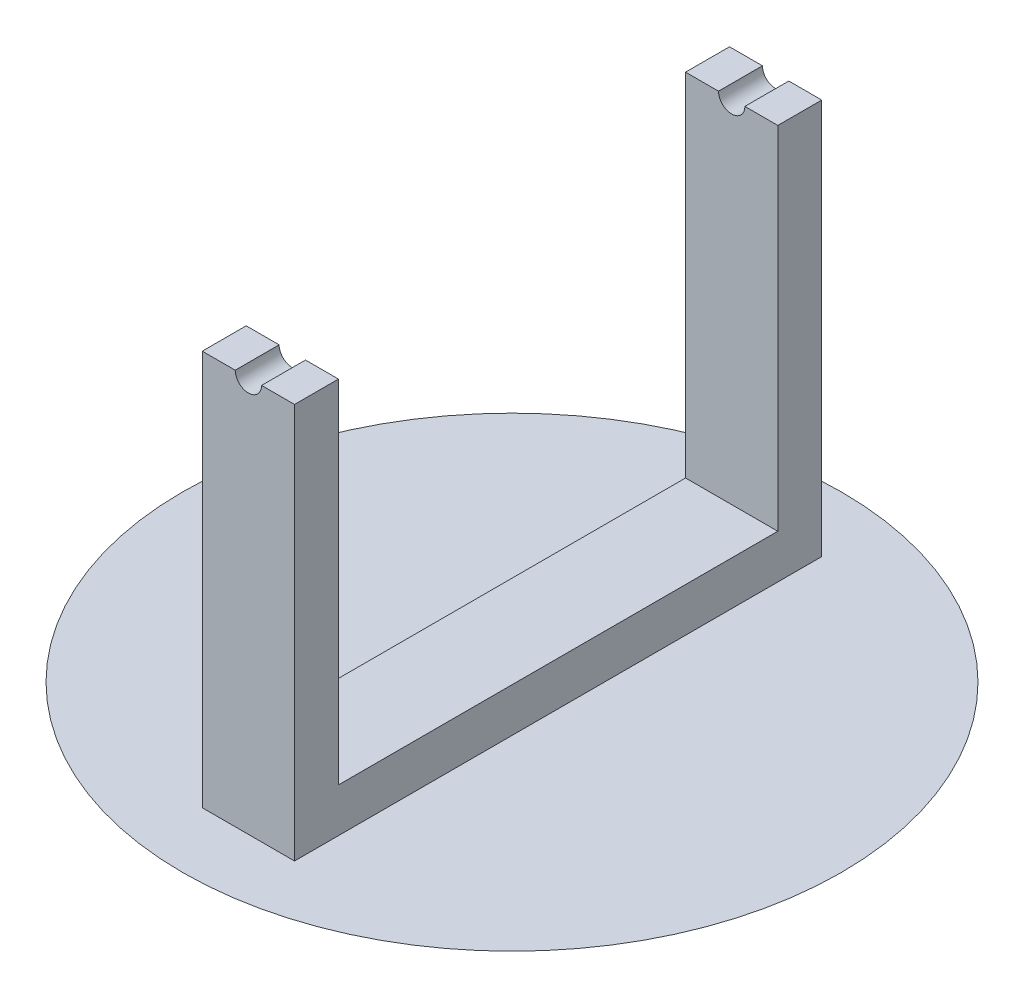
ISO-10303-21;
HEADER;
FILE_DESCRIPTION(('STEP AP214'),'2;1');
FILE_NAME('part.step','',(''),(''),'','','');
FILE_SCHEMA(('AUTOMOTIVE_DESIGN { 1 0 10303 214 1 1 1 1 }'));
ENDSEC;
DATA;
#1=APPLICATION_CONTEXT('core data for automotive mechanical design processes');
#2=APPLICATION_PROTOCOL_DEFINITION('international standard','automotive_design',2000,#1);
#3=PRODUCT_CONTEXT('',#1,'mechanical');
#4=PRODUCT('Part','Part','',(#3));
#5=PRODUCT_RELATED_PRODUCT_CATEGORY('part','',(#4));
#6=PRODUCT_DEFINITION_FORMATION('','',#4);
#7=PRODUCT_DEFINITION_CONTEXT('part definition',#1,'design');
#8=PRODUCT_DEFINITION('design','',#6,#7);
#9=PRODUCT_DEFINITION_SHAPE('','',#8);
#10=(LENGTH_UNIT() NAMED_UNIT(*) SI_UNIT(.MILLI.,.METRE.));
#11=(NAMED_UNIT(*) PLANE_ANGLE_UNIT() SI_UNIT($,.RADIAN.));
#12=(NAMED_UNIT(*) SI_UNIT($,.STERADIAN.) SOLID_ANGLE_UNIT());
#13=UNCERTAINTY_MEASURE_WITH_UNIT(LENGTH_MEASURE(1.E-05),#10,'distance_accuracy_value','');
#14=(GEOMETRIC_REPRESENTATION_CONTEXT(3) GLOBAL_UNCERTAINTY_ASSIGNED_CONTEXT((#13)) GLOBAL_UNIT_ASSIGNED_CONTEXT((#10,
#11,#12)) REPRESENTATION_CONTEXT('',''));
#15=CARTESIAN_POINT('',(0.,0.,0.));
#16=DIRECTION('',(0.,0.,1.));
#17=DIRECTION('',(1.,0.,0.));
#18=AXIS2_PLACEMENT_3D('',#15,#16,#17);
#19=CARTESIAN_POINT('',(21.,0.,-100.));
#20=DIRECTION('',(0.,-1.,0.));
#21=DIRECTION('',(0.,0.,-1.));
#22=AXIS2_PLACEMENT_3D('',#19,#20,#21);
#23=PLANE('',#22);
#24=DIRECTION('',(-1.,0.,0.));
#25=VECTOR('',#24,1.);
#26=CARTESIAN_POINT('',(21.,0.,-120.));
#27=LINE('',#26,#25);
#28=CARTESIAN_POINT('',(21.,0.,-120.));
#29=VERTEX_POINT('',#28);
#30=CARTESIAN_POINT('',(6.,0.,-120.));
#31=VERTEX_POINT('',#30);
#32=EDGE_CURVE('E180',#29,#31,#27,.T.);
#33=ORIENTED_EDGE('',*,*,#32,.T.);
#34=DIRECTION('',(0.,0.,1.));
#35=VECTOR('',#34,1.);
#36=CARTESIAN_POINT('',(6.,0.,-150.));
#37=LINE('',#36,#35);
#38=CARTESIAN_POINT('',(6.,0.,-100.));
#39=VERTEX_POINT('',#38);
#40=EDGE_CURVE('E311',#31,#39,#37,.T.);
#41=ORIENTED_EDGE('',*,*,#40,.T.);
#42=DIRECTION('',(-1.,0.,0.));
#43=VECTOR('',#42,1.);
#44=CARTESIAN_POINT('',(21.,0.,-100.));
#45=LINE('',#44,#43);
#46=CARTESIAN_POINT('',(21.,0.,-100.));
#47=VERTEX_POINT('',#46);
#48=EDGE_CURVE('E175',#47,#39,#45,.T.);
#49=ORIENTED_EDGE('',*,*,#48,.F.);
#50=DIRECTION('',(0.,0.,1.));
#51=VECTOR('',#50,1.);
#52=CARTESIAN_POINT('',(21.,0.,-100.));
#53=LINE('',#52,#51);
#54=EDGE_CURVE('E241',#29,#47,#53,.T.);
#55=ORIENTED_EDGE('',*,*,#54,.F.);
#56=EDGE_LOOP('',(#33,#41,#49,#55));
#57=FACE_BOUND('',#56,.T.);
#58=ADVANCED_FACE('F42',(#57),#23,.F.);
#59=CARTESIAN_POINT('',(21.,0.,120.));
#60=DIRECTION('',(0.,-1.,0.));
#61=DIRECTION('',(0.,0.,-1.));
#62=AXIS2_PLACEMENT_3D('',#59,#60,#61);
#63=PLANE('',#62);
#64=DIRECTION('',(-1.,0.,0.));
#65=VECTOR('',#64,1.);
#66=CARTESIAN_POINT('',(21.,0.,100.));
#67=LINE('',#66,#65);
#68=CARTESIAN_POINT('',(21.,0.,100.));
#69=VERTEX_POINT('',#68);
#70=CARTESIAN_POINT('',(6.,0.,100.));
#71=VERTEX_POINT('',#70);
#72=EDGE_CURVE('E162',#69,#71,#67,.T.);
#73=ORIENTED_EDGE('',*,*,#72,.T.);
#74=DIRECTION('',(0.,0.,1.));
#75=VECTOR('',#74,1.);
#76=CARTESIAN_POINT('',(6.,0.,-150.));
#77=LINE('',#76,#75);
#78=CARTESIAN_POINT('',(6.,0.,120.));
#79=VERTEX_POINT('',#78);
#80=EDGE_CURVE('E11',#71,#79,#77,.T.);
#81=ORIENTED_EDGE('',*,*,#80,.T.);
#82=DIRECTION('',(-1.,0.,0.));
#83=VECTOR('',#82,1.);
#84=CARTESIAN_POINT('',(21.,0.,120.));
#85=LINE('',#84,#83);
#86=CARTESIAN_POINT('',(21.,0.,120.));
#87=VERTEX_POINT('',#86);
#88=EDGE_CURVE('E143',#87,#79,#85,.T.);
#89=ORIENTED_EDGE('',*,*,#88,.F.);
#90=DIRECTION('',(0.,0.,1.));
#91=VECTOR('',#90,1.);
#92=CARTESIAN_POINT('',(21.,0.,120.));
#93=LINE('',#92,#91);
#94=EDGE_CURVE('E152',#69,#87,#93,.T.);
#95=ORIENTED_EDGE('',*,*,#94,.F.);
#96=EDGE_LOOP('',(#73,#81,#89,#95));
#97=FACE_BOUND('',#96,.T.);
#98=ADVANCED_FACE('F259',(#97),#63,.F.);
#99=CARTESIAN_POINT('',(21.,-180.,120.));
#100=DIRECTION('',(0.,0.,-1.));
#101=DIRECTION('',(-1.,0.,0.));
#102=AXIS2_PLACEMENT_3D('',#99,#100,#101);
#103=PLANE('',#102);
#104=ORIENTED_EDGE('',*,*,#88,.T.);
#105=CARTESIAN_POINT('',(0.,0.,120.));
#106=DIRECTION('',(0.,0.,-1.));
#107=DIRECTION('',(-1.,0.,0.));
#108=AXIS2_PLACEMENT_3D('',#105,#106,#107);
#109=CIRCLE('',#108,6.);
#110=CARTESIAN_POINT('',(-6.,0.,120.));
#111=VERTEX_POINT('',#110);
#112=EDGE_CURVE('E131',#79,#111,#109,.T.);
#113=ORIENTED_EDGE('',*,*,#112,.T.);
#114=CARTESIAN_POINT('',(-21.,0.,120.));
#115=VERTEX_POINT('',#114);
#116=EDGE_CURVE('E139',#111,#115,#85,.T.);
#117=ORIENTED_EDGE('',*,*,#116,.T.);
#118=DIRECTION('',(0.,-1.,0.));
#119=VECTOR('',#118,1.);
#120=CARTESIAN_POINT('',(-21.,-180.,120.));
#121=LINE('',#120,#119);
#122=CARTESIAN_POINT('',(-21.,-180.,120.));
#123=VERTEX_POINT('',#122);
#124=EDGE_CURVE('E200',#115,#123,#121,.T.);
#125=ORIENTED_EDGE('',*,*,#124,.T.);
#126=DIRECTION('',(-1.,0.,0.));
#127=VECTOR('',#126,1.);
#128=CARTESIAN_POINT('',(21.,-180.,120.));
#129=LINE('',#128,#127);
#130=CARTESIAN_POINT('',(21.,-180.,120.));
#131=VERTEX_POINT('',#130);
#132=EDGE_CURVE('E136',#131,#123,#129,.T.);
#133=ORIENTED_EDGE('',*,*,#132,.F.);
#134=DIRECTION('',(0.,-1.,0.));
#135=VECTOR('',#134,1.);
#136=CARTESIAN_POINT('',(21.,-180.,120.));
#137=LINE('',#136,#135);
#138=EDGE_CURVE('E199',#87,#131,#137,.T.);
#139=ORIENTED_EDGE('',*,*,#138,.F.);
#140=EDGE_LOOP('',(#104,#113,#117,#125,#133,#139));
#141=FACE_BOUND('',#140,.T.);
#142=ADVANCED_FACE('F44',(#141),#103,.F.);
#143=CARTESIAN_POINT('',(21.,0.,-120.));
#144=DIRECTION('',(0.,0.,1.));
#145=DIRECTION('',(1.,0.,0.));
#146=AXIS2_PLACEMENT_3D('',#143,#144,#145);
#147=PLANE('',#146);
#148=CARTESIAN_POINT('',(-6.,0.,-120.));
#149=VERTEX_POINT('',#148);
#150=CARTESIAN_POINT('',(-21.,0.,-120.));
#151=VERTEX_POINT('',#150);
#152=EDGE_CURVE('E179',#149,#151,#27,.T.);
#153=ORIENTED_EDGE('',*,*,#152,.F.);
#154=CARTESIAN_POINT('',(0.,0.,-120.));
#155=DIRECTION('',(0.,0.,1.));
#156=DIRECTION('',(1.,0.,0.));
#157=AXIS2_PLACEMENT_3D('',#154,#155,#156);
#158=CIRCLE('',#157,6.);
#159=EDGE_CURVE('E298',#149,#31,#158,.T.);
#160=ORIENTED_EDGE('',*,*,#159,.T.);
#161=ORIENTED_EDGE('',*,*,#32,.F.);
#162=DIRECTION('',(0.,1.,0.));
#163=VECTOR('',#162,1.);
#164=CARTESIAN_POINT('',(21.,0.,-120.));
#165=LINE('',#164,#163);
#166=CARTESIAN_POINT('',(21.,-180.,-120.));
#167=VERTEX_POINT('',#166);
#168=EDGE_CURVE('E234',#167,#29,#165,.T.);
#169=ORIENTED_EDGE('',*,*,#168,.F.);
#170=DIRECTION('',(-1.,0.,0.));
#171=VECTOR('',#170,1.);
#172=CARTESIAN_POINT('',(21.,-180.,-120.));
#173=LINE('',#172,#171);
#174=CARTESIAN_POINT('',(-21.,-180.,-120.));
#175=VERTEX_POINT('',#174);
#176=EDGE_CURVE('E184',#167,#175,#173,.T.);
#177=ORIENTED_EDGE('',*,*,#176,.T.);
#178=DIRECTION('',(0.,1.,0.));
#179=VECTOR('',#178,1.);
#180=CARTESIAN_POINT('',(-21.,0.,-120.));
#181=LINE('',#180,#179);
#182=EDGE_CURVE('E209',#175,#151,#181,.T.);
#183=ORIENTED_EDGE('',*,*,#182,.T.);
#184=EDGE_LOOP('',(#153,#160,#161,#169,#177,#183));
#185=FACE_BOUND('',#184,.T.);
#186=ADVANCED_FACE('F266',(#185),#147,.F.);
#187=CARTESIAN_POINT('',(-6.,0.,-100.));
#188=VERTEX_POINT('',#187);
#189=CARTESIAN_POINT('',(-21.,0.,-100.));
#190=VERTEX_POINT('',#189);
#191=EDGE_CURVE('E174',#188,#190,#45,.T.);
#192=ORIENTED_EDGE('',*,*,#191,.F.);
#193=DIRECTION('',(0.,0.,1.));
#194=VECTOR('',#193,1.);
#195=CARTESIAN_POINT('',(-6.,0.,-150.));
#196=LINE('',#195,#194);
#197=EDGE_CURVE('E58',#188,#149,#196,.F.);
#198=ORIENTED_EDGE('',*,*,#197,.T.);
#199=ORIENTED_EDGE('',*,*,#152,.T.);
#200=DIRECTION('',(0.,0.,1.));
#201=VECTOR('',#200,1.);
#202=CARTESIAN_POINT('',(-21.,0.,-100.));
#203=LINE('',#202,#201);
#204=EDGE_CURVE('E213',#151,#190,#203,.T.);
#205=ORIENTED_EDGE('',*,*,#204,.T.);
#206=EDGE_LOOP('',(#192,#198,#199,#205));
#207=FACE_BOUND('',#206,.T.);
#208=ADVANCED_FACE('F269',(#207),#23,.F.);
#209=CARTESIAN_POINT('',(21.,-160.,-100.));
#210=DIRECTION('',(0.,0.,-1.));
#211=DIRECTION('',(-1.,0.,0.));
#212=AXIS2_PLACEMENT_3D('',#209,#210,#211);
#213=PLANE('',#212);
#214=ORIENTED_EDGE('',*,*,#48,.T.);
#215=CARTESIAN_POINT('',(0.,0.,-100.));
#216=DIRECTION('',(0.,0.,-1.));
#217=DIRECTION('',(-1.,0.,0.));
#218=AXIS2_PLACEMENT_3D('',#215,#216,#217);
#219=CIRCLE('',#218,6.);
#220=EDGE_CURVE('E145',#39,#188,#219,.T.);
#221=ORIENTED_EDGE('',*,*,#220,.T.);
#222=ORIENTED_EDGE('',*,*,#191,.T.);
#223=DIRECTION('',(0.,-1.,0.));
#224=VECTOR('',#223,1.);
#225=CARTESIAN_POINT('',(-21.,-160.,-100.));
#226=LINE('',#225,#224);
#227=CARTESIAN_POINT('',(-21.,-160.,-100.));
#228=VERTEX_POINT('',#227);
#229=EDGE_CURVE('E219',#190,#228,#226,.T.);
#230=ORIENTED_EDGE('',*,*,#229,.T.);
#231=DIRECTION('',(-1.,0.,0.));
#232=VECTOR('',#231,1.);
#233=CARTESIAN_POINT('',(21.,-160.,-100.));
#234=LINE('',#233,#232);
#235=CARTESIAN_POINT('',(21.,-160.,-100.));
#236=VERTEX_POINT('',#235);
#237=EDGE_CURVE('E170',#236,#228,#234,.T.);
#238=ORIENTED_EDGE('',*,*,#237,.F.);
#239=DIRECTION('',(0.,-1.,0.));
#240=VECTOR('',#239,1.);
#241=CARTESIAN_POINT('',(21.,-160.,-100.));
#242=LINE('',#241,#240);
#243=EDGE_CURVE('E244',#47,#236,#242,.T.);
#244=ORIENTED_EDGE('',*,*,#243,.F.);
#245=EDGE_LOOP('',(#214,#221,#222,#230,#238,#244));
#246=FACE_BOUND('',#245,.T.);
#247=ADVANCED_FACE('F284',(#246),#213,.F.);
#248=CARTESIAN_POINT('',(21.,-160.,100.));
#249=DIRECTION('',(0.,-1.,0.));
#250=DIRECTION('',(0.,0.,-1.));
#251=AXIS2_PLACEMENT_3D('',#248,#249,#250);
#252=PLANE('',#251);
#253=DIRECTION('',(0.,0.,1.));
#254=VECTOR('',#253,1.);
#255=CARTESIAN_POINT('',(-21.,-160.,100.));
#256=LINE('',#255,#254);
#257=CARTESIAN_POINT('',(-21.,-160.,100.));
#258=VERTEX_POINT('',#257);
#259=EDGE_CURVE('E222',#228,#258,#256,.T.);
#260=ORIENTED_EDGE('',*,*,#259,.T.);
#261=DIRECTION('',(-1.,0.,0.));
#262=VECTOR('',#261,1.);
#263=CARTESIAN_POINT('',(21.,-160.,100.));
#264=LINE('',#263,#262);
#265=CARTESIAN_POINT('',(21.,-160.,100.));
#266=VERTEX_POINT('',#265);
#267=EDGE_CURVE('E166',#266,#258,#264,.T.);
#268=ORIENTED_EDGE('',*,*,#267,.F.);
#269=DIRECTION('',(0.,0.,1.));
#270=VECTOR('',#269,1.);
#271=CARTESIAN_POINT('',(21.,-160.,100.));
#272=LINE('',#271,#270);
#273=EDGE_CURVE('E247',#236,#266,#272,.T.);
#274=ORIENTED_EDGE('',*,*,#273,.F.);
#275=ORIENTED_EDGE('',*,*,#237,.T.);
#276=EDGE_LOOP('',(#260,#268,#274,#275));
#277=FACE_BOUND('',#276,.T.);
#278=ADVANCED_FACE('F279',(#277),#252,.F.);
#279=CARTESIAN_POINT('',(21.,0.,100.));
#280=DIRECTION('',(0.,0.,1.));
#281=DIRECTION('',(1.,0.,0.));
#282=AXIS2_PLACEMENT_3D('',#279,#280,#281);
#283=PLANE('',#282);
#284=CARTESIAN_POINT('',(-5.99999999999999,0.,100.));
#285=VERTEX_POINT('',#284);
#286=CARTESIAN_POINT('',(-21.,0.,100.));
#287=VERTEX_POINT('',#286);
#288=EDGE_CURVE('E156',#285,#287,#67,.T.);
#289=ORIENTED_EDGE('',*,*,#288,.F.);
#290=CARTESIAN_POINT('',(0.,0.,100.));
#291=DIRECTION('',(0.,0.,1.));
#292=DIRECTION('',(1.,0.,0.));
#293=AXIS2_PLACEMENT_3D('',#290,#291,#292);
#294=CIRCLE('',#293,6.);
#295=EDGE_CURVE('E66',#285,#71,#294,.T.);
#296=ORIENTED_EDGE('',*,*,#295,.T.);
#297=ORIENTED_EDGE('',*,*,#72,.F.);
#298=DIRECTION('',(0.,1.,0.));
#299=VECTOR('',#298,1.);
#300=CARTESIAN_POINT('',(21.,0.,100.));
#301=LINE('',#300,#299);
#302=EDGE_CURVE('E157',#266,#69,#301,.T.);
#303=ORIENTED_EDGE('',*,*,#302,.F.);
#304=ORIENTED_EDGE('',*,*,#267,.T.);
#305=DIRECTION('',(0.,1.,0.));
#306=VECTOR('',#305,1.);
#307=CARTESIAN_POINT('',(-21.,0.,100.));
#308=LINE('',#307,#306);
#309=EDGE_CURVE('E224',#258,#287,#308,.T.);
#310=ORIENTED_EDGE('',*,*,#309,.T.);
#311=EDGE_LOOP('',(#289,#296,#297,#303,#304,#310));
#312=FACE_BOUND('',#311,.T.);
#313=ADVANCED_FACE('F257',(#312),#283,.F.);
#314=ORIENTED_EDGE('',*,*,#116,.F.);
#315=DIRECTION('',(0.,0.,1.));
#316=VECTOR('',#315,1.);
#317=CARTESIAN_POINT('',(-6.,0.,-150.));
#318=LINE('',#317,#316);
#319=EDGE_CURVE('E51',#111,#285,#318,.F.);
#320=ORIENTED_EDGE('',*,*,#319,.T.);
#321=ORIENTED_EDGE('',*,*,#288,.T.);
#322=DIRECTION('',(0.,0.,1.));
#323=VECTOR('',#322,1.);
#324=CARTESIAN_POINT('',(-21.,0.,120.));
#325=LINE('',#324,#323);
#326=EDGE_CURVE('E149',#287,#115,#325,.T.);
#327=ORIENTED_EDGE('',*,*,#326,.T.);
#328=EDGE_LOOP('',(#314,#320,#321,#327));
#329=FACE_BOUND('',#328,.T.);
#330=ADVANCED_FACE('F147',(#329),#63,.F.);
#331=CARTESIAN_POINT('',(21.,0.,0.));
#332=DIRECTION('',(-1.,0.,0.));
#333=DIRECTION('',(0.,0.,1.));
#334=AXIS2_PLACEMENT_3D('',#331,#332,#333);
#335=PLANE('',#334);
#336=ORIENTED_EDGE('',*,*,#138,.T.);
#337=DIRECTION('',(0.,0.,-1.));
#338=VECTOR('',#337,1.);
#339=CARTESIAN_POINT('',(21.,-180.,-120.));
#340=LINE('',#339,#338);
#341=EDGE_CURVE('E198',#131,#167,#340,.T.);
#342=ORIENTED_EDGE('',*,*,#341,.T.);
#343=ORIENTED_EDGE('',*,*,#168,.T.);
#344=ORIENTED_EDGE('',*,*,#54,.T.);
#345=ORIENTED_EDGE('',*,*,#243,.T.);
#346=ORIENTED_EDGE('',*,*,#273,.T.);
#347=ORIENTED_EDGE('',*,*,#302,.T.);
#348=ORIENTED_EDGE('',*,*,#94,.T.);
#349=EDGE_LOOP('',(#336,#342,#343,#344,#345,#346,#347,#348));
#350=FACE_BOUND('',#349,.T.);
#351=ADVANCED_FACE('F253',(#350),#335,.F.);
#352=CARTESIAN_POINT('',(-21.,0.,0.));
#353=DIRECTION('',(-1.,0.,0.));
#354=DIRECTION('',(0.,0.,1.));
#355=AXIS2_PLACEMENT_3D('',#352,#353,#354);
#356=PLANE('',#355);
#357=ORIENTED_EDGE('',*,*,#124,.F.);
#358=ORIENTED_EDGE('',*,*,#326,.F.);
#359=ORIENTED_EDGE('',*,*,#309,.F.);
#360=ORIENTED_EDGE('',*,*,#259,.F.);
#361=ORIENTED_EDGE('',*,*,#229,.F.);
#362=ORIENTED_EDGE('',*,*,#204,.F.);
#363=ORIENTED_EDGE('',*,*,#182,.F.);
#364=DIRECTION('',(0.,0.,-1.));
#365=VECTOR('',#364,1.);
#366=CARTESIAN_POINT('',(-21.,-180.,-120.));
#367=LINE('',#366,#365);
#368=EDGE_CURVE('E197',#123,#175,#367,.T.);
#369=ORIENTED_EDGE('',*,*,#368,.F.);
#370=EDGE_LOOP('',(#357,#358,#359,#360,#361,#362,#363,#369));
#371=FACE_BOUND('',#370,.T.);
#372=ADVANCED_FACE('F206',(#371),#356,.T.);
#373=CARTESIAN_POINT('',(0.,-180.,0.));
#374=DIRECTION('',(0.,1.,0.));
#375=DIRECTION('',(0.,0.,1.));
#376=AXIS2_PLACEMENT_3D('',#373,#374,#375);
#377=PLANE('',#376);
#378=ORIENTED_EDGE('',*,*,#132,.T.);
#379=ORIENTED_EDGE('',*,*,#368,.T.);
#380=ORIENTED_EDGE('',*,*,#176,.F.);
#381=ORIENTED_EDGE('',*,*,#341,.F.);
#382=EDGE_LOOP('',(#378,#379,#380,#381));
#383=FACE_BOUND('',#382,.T.);
#384=CARTESIAN_POINT('',(0.,-180.,0.));
#385=DIRECTION('',(0.,1.,0.));
#386=DIRECTION('',(0.,0.,1.));
#387=AXIS2_PLACEMENT_3D('',#384,#385,#386);
#388=CIRCLE('',#387,150.);
#389=CARTESIAN_POINT('',(0.,-180.,150.));
#390=VERTEX_POINT('',#389);
#391=EDGE_CURVE('E316',#390,#390,#388,.T.);
#392=ORIENTED_EDGE('',*,*,#391,.T.);
#393=EDGE_LOOP('',(#392));
#394=FACE_BOUND('',#393,.T.);
#395=ADVANCED_FACE('F193',(#383,#394),#377,.T.);
#396=CARTESIAN_POINT('',(3.05484517383204E-13,-220.,0.));
#397=DIRECTION('',(0.,-1.,0.));
#398=DIRECTION('',(0.,0.,-1.));
#399=AXIS2_PLACEMENT_3D('',#396,#397,#398);
#400=PLANE('',#399);
#401=CARTESIAN_POINT('',(0.,-220.,0.));
#402=DIRECTION('',(0.,1.,0.));
#403=DIRECTION('',(0.,0.,1.));
#404=AXIS2_PLACEMENT_3D('',#401,#402,#403);
#405=CIRCLE('',#404,79.9546463139228);
#406=CARTESIAN_POINT('',(0.,-220.,79.9546463139228));
#407=VERTEX_POINT('',#406);
#408=EDGE_CURVE('E203',#407,#407,#405,.T.);
#409=ORIENTED_EDGE('',*,*,#408,.F.);
#410=EDGE_LOOP('',(#409));
#411=FACE_BOUND('',#410,.T.);
#412=ADVANCED_FACE('F330',(#411),#400,.T.);
#413=CARTESIAN_POINT('',(0.,-180.,0.));
#414=DIRECTION('',(0.,1.,0.));
#415=DIRECTION('',(0.,0.,1.));
#416=AXIS2_PLACEMENT_3D('',#413,#414,#415);
#417=CONICAL_SURFACE('',#416,150.,1.05192917589528);
#418=ORIENTED_EDGE('',*,*,#408,.T.);
#419=EDGE_LOOP('',(#418));
#420=FACE_BOUND('',#419,.T.);
#421=ORIENTED_EDGE('',*,*,#391,.F.);
#422=EDGE_LOOP('',(#421));
#423=FACE_BOUND('',#422,.T.);
#424=ADVANCED_FACE('F327',(#420,#423),#417,.T.);
#425=CARTESIAN_POINT('',(0.,0.,-150.));
#426=DIRECTION('',(0.,0.,1.));
#427=DIRECTION('',(1.,0.,0.));
#428=AXIS2_PLACEMENT_3D('',#425,#426,#427);
#429=CYLINDRICAL_SURFACE('',#428,6.);
#430=ORIENTED_EDGE('',*,*,#295,.F.);
#431=ORIENTED_EDGE('',*,*,#319,.F.);
#432=ORIENTED_EDGE('',*,*,#112,.F.);
#433=ORIENTED_EDGE('',*,*,#80,.F.);
#434=EDGE_LOOP('',(#430,#431,#432,#433));
#435=FACE_BOUND('',#434,.T.);
#436=ADVANCED_FACE('F130',(#435),#429,.F.);
#437=ORIENTED_EDGE('',*,*,#197,.F.);
#438=ORIENTED_EDGE('',*,*,#220,.F.);
#439=ORIENTED_EDGE('',*,*,#40,.F.);
#440=ORIENTED_EDGE('',*,*,#159,.F.);
#441=EDGE_LOOP('',(#437,#438,#439,#440));
#442=FACE_BOUND('',#441,.T.);
#443=ADVANCED_FACE('F381',(#442),#429,.F.);
#444=CLOSED_SHELL('',(#58,#98,#142,#186,#208,#247,#278,#313,#330,#351,#372,#395,#412,#424,#436,#443));
#445=MANIFOLD_SOLID_BREP('B2',#444);
#446=ADVANCED_BREP_SHAPE_REPRESENTATION('',(#18,#445),#14);
#447=SHAPE_DEFINITION_REPRESENTATION(#9,#446);
ENDSEC;
END-ISO-10303-21;
